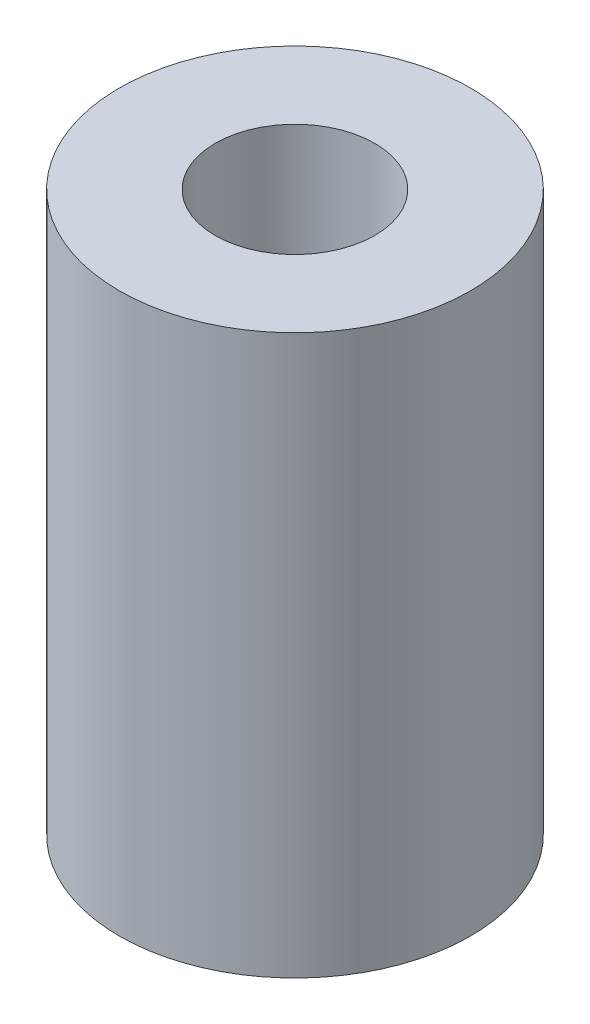
ISO-10303-21;
HEADER;
FILE_DESCRIPTION(('STEP AP214'),'2;1');
FILE_NAME('part.step','',(''),(''),'','','');
FILE_SCHEMA(('AUTOMOTIVE_DESIGN { 1 0 10303 214 1 1 1 1 }'));
ENDSEC;
DATA;
#1=APPLICATION_CONTEXT('core data for automotive mechanical design processes');
#2=APPLICATION_PROTOCOL_DEFINITION('international standard','automotive_design',2000,#1);
#3=PRODUCT_CONTEXT('',#1,'mechanical');
#4=PRODUCT('Part','Part','',(#3));
#5=PRODUCT_RELATED_PRODUCT_CATEGORY('part','',(#4));
#6=PRODUCT_DEFINITION_FORMATION('','',#4);
#7=PRODUCT_DEFINITION_CONTEXT('part definition',#1,'design');
#8=PRODUCT_DEFINITION('design','',#6,#7);
#9=PRODUCT_DEFINITION_SHAPE('','',#8);
#10=(LENGTH_UNIT() NAMED_UNIT(*) SI_UNIT(.MILLI.,.METRE.));
#11=(NAMED_UNIT(*) PLANE_ANGLE_UNIT() SI_UNIT($,.RADIAN.));
#12=(NAMED_UNIT(*) SI_UNIT($,.STERADIAN.) SOLID_ANGLE_UNIT());
#13=UNCERTAINTY_MEASURE_WITH_UNIT(LENGTH_MEASURE(1.E-05),#10,'distance_accuracy_value','');
#14=(GEOMETRIC_REPRESENTATION_CONTEXT(3) GLOBAL_UNCERTAINTY_ASSIGNED_CONTEXT((#13)) GLOBAL_UNIT_ASSIGNED_CONTEXT((#10,
#11,#12)) REPRESENTATION_CONTEXT('',''));
#15=CARTESIAN_POINT('',(0.,0.,0.));
#16=DIRECTION('',(0.,0.,1.));
#17=DIRECTION('',(1.,0.,0.));
#18=AXIS2_PLACEMENT_3D('',#15,#16,#17);
#19=CARTESIAN_POINT('',(0.,17.5,0.));
#20=DIRECTION('',(0.,1.,0.));
#21=DIRECTION('',(0.,0.,1.));
#22=AXIS2_PLACEMENT_3D('',#19,#20,#21);
#23=PLANE('',#22);
#24=CARTESIAN_POINT('',(0.,17.5,0.));
#25=DIRECTION('',(0.,1.,0.));
#26=DIRECTION('',(0.,0.,1.));
#27=AXIS2_PLACEMENT_3D('',#24,#25,#26);
#28=CIRCLE('',#27,5.5);
#29=CARTESIAN_POINT('',(0.,17.5,5.5));
#30=VERTEX_POINT('',#29);
#31=EDGE_CURVE('E10',#30,#30,#28,.T.);
#32=ORIENTED_EDGE('',*,*,#31,.T.);
#33=EDGE_LOOP('',(#32));
#34=FACE_BOUND('',#33,.T.);
#35=CARTESIAN_POINT('',(0.,17.5,0.));
#36=DIRECTION('',(0.,1.,0.));
#37=DIRECTION('',(0.,0.,1.));
#38=AXIS2_PLACEMENT_3D('',#35,#36,#37);
#39=CIRCLE('',#38,2.5);
#40=CARTESIAN_POINT('',(0.,17.5,2.5));
#41=VERTEX_POINT('',#40);
#42=EDGE_CURVE('E50',#41,#41,#39,.T.);
#43=ORIENTED_EDGE('',*,*,#42,.F.);
#44=EDGE_LOOP('',(#43));
#45=FACE_BOUND('',#44,.T.);
#46=ADVANCED_FACE('F39',(#34,#45),#23,.T.);
#47=CARTESIAN_POINT('',(0.,0.,0.));
#48=DIRECTION('',(0.,1.,0.));
#49=DIRECTION('',(0.,0.,1.));
#50=AXIS2_PLACEMENT_3D('',#47,#48,#49);
#51=PLANE('',#50);
#52=CARTESIAN_POINT('',(0.,0.,0.));
#53=DIRECTION('',(0.,1.,0.));
#54=DIRECTION('',(0.,0.,1.));
#55=AXIS2_PLACEMENT_3D('',#52,#53,#54);
#56=CIRCLE('',#55,5.5);
#57=CARTESIAN_POINT('',(0.,0.,5.5));
#58=VERTEX_POINT('',#57);
#59=EDGE_CURVE('E43',#58,#58,#56,.T.);
#60=ORIENTED_EDGE('',*,*,#59,.F.);
#61=EDGE_LOOP('',(#60));
#62=FACE_BOUND('',#61,.T.);
#63=CARTESIAN_POINT('',(0.,0.,0.));
#64=DIRECTION('',(0.,1.,0.));
#65=DIRECTION('',(0.,0.,1.));
#66=AXIS2_PLACEMENT_3D('',#63,#64,#65);
#67=CIRCLE('',#66,2.5);
#68=CARTESIAN_POINT('',(0.,0.,2.5));
#69=VERTEX_POINT('',#68);
#70=EDGE_CURVE('E52',#69,#69,#67,.T.);
#71=ORIENTED_EDGE('',*,*,#70,.T.);
#72=EDGE_LOOP('',(#71));
#73=FACE_BOUND('',#72,.T.);
#74=ADVANCED_FACE('F62',(#62,#73),#51,.F.);
#75=CARTESIAN_POINT('',(0.,17.5,0.));
#76=DIRECTION('',(0.,-1.,0.));
#77=DIRECTION('',(0.,0.,-1.));
#78=AXIS2_PLACEMENT_3D('',#75,#76,#77);
#79=CYLINDRICAL_SURFACE('',#78,5.5);
#80=ORIENTED_EDGE('',*,*,#31,.F.);
#81=EDGE_LOOP('',(#80));
#82=FACE_BOUND('',#81,.T.);
#83=ORIENTED_EDGE('',*,*,#59,.T.);
#84=EDGE_LOOP('',(#83));
#85=FACE_BOUND('',#84,.T.);
#86=ADVANCED_FACE('F41',(#82,#85),#79,.T.);
#87=CARTESIAN_POINT('',(0.,17.5,0.));
#88=DIRECTION('',(0.,-1.,0.));
#89=DIRECTION('',(0.,0.,-1.));
#90=AXIS2_PLACEMENT_3D('',#87,#88,#89);
#91=CYLINDRICAL_SURFACE('',#90,2.5);
#92=ORIENTED_EDGE('',*,*,#42,.T.);
#93=EDGE_LOOP('',(#92));
#94=FACE_BOUND('',#93,.T.);
#95=ORIENTED_EDGE('',*,*,#70,.F.);
#96=EDGE_LOOP('',(#95));
#97=FACE_BOUND('',#96,.T.);
#98=ADVANCED_FACE('F58',(#94,#97),#91,.F.);
#99=CLOSED_SHELL('',(#46,#74,#86,#98));
#100=MANIFOLD_SOLID_BREP('B2',#99);
#101=ADVANCED_BREP_SHAPE_REPRESENTATION('',(#18,#100),#14);
#102=SHAPE_DEFINITION_REPRESENTATION(#9,#101);
ENDSEC;
END-ISO-10303-21;
